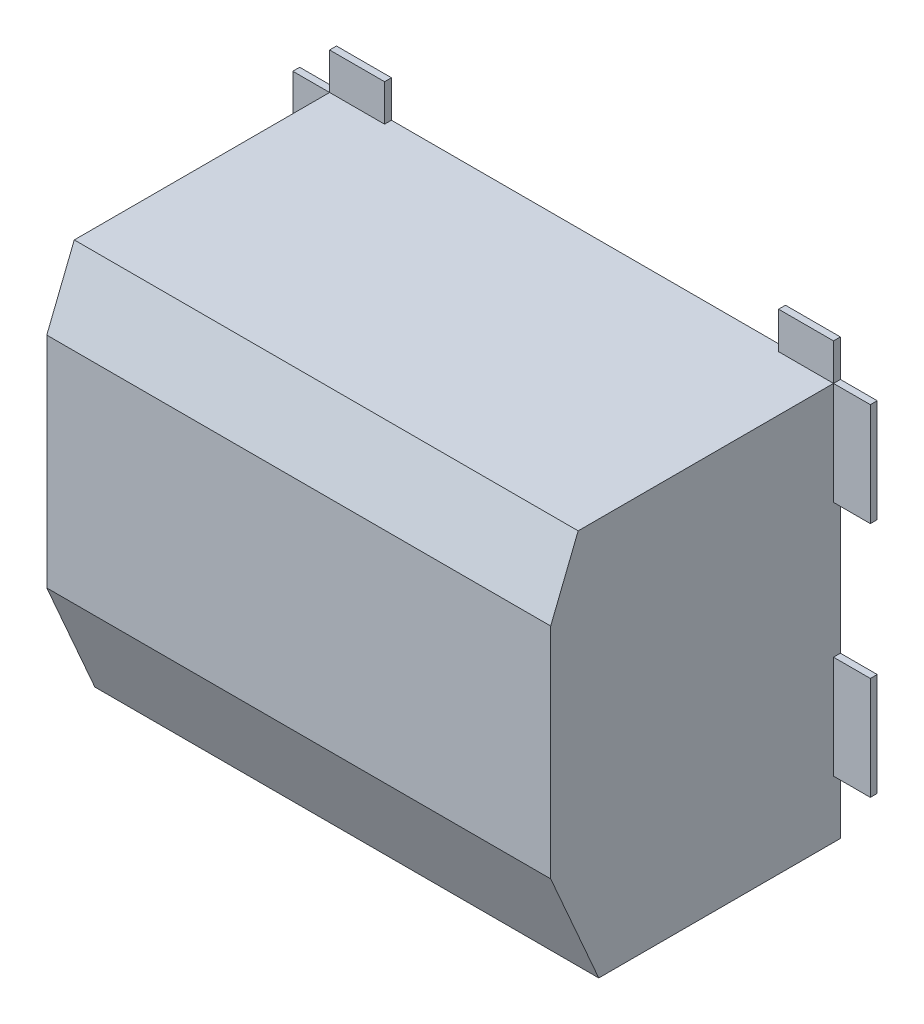
ISO-10303-21;
HEADER;
FILE_DESCRIPTION(('STEP AP214'),'2;1');
FILE_NAME('part.step','',(''),(''),'','','');
FILE_SCHEMA(('AUTOMOTIVE_DESIGN { 1 0 10303 214 1 1 1 1 }'));
ENDSEC;
DATA;
#1=APPLICATION_CONTEXT('core data for automotive mechanical design processes');
#2=APPLICATION_PROTOCOL_DEFINITION('international standard','automotive_design',2000,#1);
#3=PRODUCT_CONTEXT('',#1,'mechanical');
#4=PRODUCT('Part','Part','',(#3));
#5=PRODUCT_RELATED_PRODUCT_CATEGORY('part','',(#4));
#6=PRODUCT_DEFINITION_FORMATION('','',#4);
#7=PRODUCT_DEFINITION_CONTEXT('part definition',#1,'design');
#8=PRODUCT_DEFINITION('design','',#6,#7);
#9=PRODUCT_DEFINITION_SHAPE('','',#8);
#10=(LENGTH_UNIT() NAMED_UNIT(*) SI_UNIT(.MILLI.,.METRE.));
#11=(NAMED_UNIT(*) PLANE_ANGLE_UNIT() SI_UNIT($,.RADIAN.));
#12=(NAMED_UNIT(*) SI_UNIT($,.STERADIAN.) SOLID_ANGLE_UNIT());
#13=UNCERTAINTY_MEASURE_WITH_UNIT(LENGTH_MEASURE(1.E-05),#10,'distance_accuracy_value','');
#14=(GEOMETRIC_REPRESENTATION_CONTEXT(3) GLOBAL_UNCERTAINTY_ASSIGNED_CONTEXT((#13)) GLOBAL_UNIT_ASSIGNED_CONTEXT((#10,
#11,#12)) REPRESENTATION_CONTEXT('',''));
#15=CARTESIAN_POINT('',(0.,0.,0.));
#16=DIRECTION('',(0.,0.,1.));
#17=DIRECTION('',(1.,0.,0.));
#18=AXIS2_PLACEMENT_3D('',#15,#16,#17);
#19=CARTESIAN_POINT('',(0.,157.216,3.175));
#20=DIRECTION('',(0.,1.,0.));
#21=DIRECTION('',(0.,0.,1.));
#22=AXIS2_PLACEMENT_3D('',#19,#20,#21);
#23=PLANE('',#22);
#24=DIRECTION('',(1.,0.,0.));
#25=VECTOR('',#24,1.);
#26=CARTESIAN_POINT('',(-313.4375,157.216,242.425));
#27=LINE('',#26,#25);
#28=CARTESIAN_POINT('',(-279.4015,157.216,242.425));
#29=VERTEX_POINT('',#28);
#30=CARTESIAN_POINT('',(186.4365,157.216,242.425));
#31=VERTEX_POINT('',#30);
#32=EDGE_CURVE('E234',#29,#31,#27,.T.);
#33=ORIENTED_EDGE('',*,*,#32,.T.);
#34=DIRECTION('',(0.,0.,-1.));
#35=VECTOR('',#34,1.);
#36=CARTESIAN_POINT('',(186.4365,157.216,3.175));
#37=LINE('',#36,#35);
#38=CARTESIAN_POINT('',(186.4365,157.216,6.35));
#39=VERTEX_POINT('',#38);
#40=EDGE_CURVE('E249',#31,#39,#37,.T.);
#41=ORIENTED_EDGE('',*,*,#40,.T.);
#42=DIRECTION('',(-1.,0.,0.));
#43=VECTOR('',#42,1.);
#44=CARTESIAN_POINT('',(0.,157.216,6.35));
#45=LINE('',#44,#43);
#46=CARTESIAN_POINT('',(135.6365,157.216,6.35));
#47=VERTEX_POINT('',#46);
#48=EDGE_CURVE('E370',#39,#47,#45,.T.);
#49=ORIENTED_EDGE('',*,*,#48,.T.);
#50=DIRECTION('',(0.,0.,-1.));
#51=VECTOR('',#50,1.);
#52=CARTESIAN_POINT('',(135.6365,157.216,6.35));
#53=LINE('',#52,#51);
#54=CARTESIAN_POINT('',(135.6365,157.216,0.));
#55=VERTEX_POINT('',#54);
#56=EDGE_CURVE('E361',#47,#55,#53,.T.);
#57=ORIENTED_EDGE('',*,*,#56,.T.);
#58=DIRECTION('',(1.,0.,0.));
#59=VECTOR('',#58,1.);
#60=CARTESIAN_POINT('',(0.,157.216,0.));
#61=LINE('',#60,#59);
#62=CARTESIAN_POINT('',(-228.6015,157.216,0.));
#63=VERTEX_POINT('',#62);
#64=EDGE_CURVE('E277',#63,#55,#61,.T.);
#65=ORIENTED_EDGE('',*,*,#64,.F.);
#66=DIRECTION('',(0.,0.,-1.));
#67=VECTOR('',#66,1.);
#68=CARTESIAN_POINT('',(-228.6015,157.216,6.35));
#69=LINE('',#68,#67);
#70=CARTESIAN_POINT('',(-228.6015,157.216,6.35));
#71=VERTEX_POINT('',#70);
#72=EDGE_CURVE('E921',#71,#63,#69,.T.);
#73=ORIENTED_EDGE('',*,*,#72,.F.);
#74=DIRECTION('',(1.,0.,0.));
#75=VECTOR('',#74,1.);
#76=CARTESIAN_POINT('',(-92.965,157.216,6.35));
#77=LINE('',#76,#75);
#78=CARTESIAN_POINT('',(-279.4015,157.216,6.35));
#79=VERTEX_POINT('',#78);
#80=EDGE_CURVE('E928',#79,#71,#77,.T.);
#81=ORIENTED_EDGE('',*,*,#80,.F.);
#82=DIRECTION('',(0.,0.,-1.));
#83=VECTOR('',#82,1.);
#84=CARTESIAN_POINT('',(-279.4015,157.216,3.175));
#85=LINE('',#84,#83);
#86=EDGE_CURVE('E242',#29,#79,#85,.T.);
#87=ORIENTED_EDGE('',*,*,#86,.F.);
#88=EDGE_LOOP('',(#33,#41,#49,#57,#65,#73,#81,#87));
#89=FACE_BOUND('',#88,.T.);
#90=ADVANCED_FACE('F42',(#89),#23,.T.);
#91=DIRECTION('',(0.,0.,-1.));
#92=VECTOR('',#91,1.);
#93=CARTESIAN_POINT('',(-279.4015,157.216,6.35));
#94=LINE('',#93,#92);
#95=CARTESIAN_POINT('',(-279.4015,157.216,0.));
#96=VERTEX_POINT('',#95);
#97=EDGE_CURVE('E917',#79,#96,#94,.T.);
#98=ORIENTED_EDGE('',*,*,#97,.T.);
#99=CARTESIAN_POINT('',(-313.4375,157.216,0.));
#100=VERTEX_POINT('',#99);
#101=EDGE_CURVE('E274',#100,#96,#61,.T.);
#102=ORIENTED_EDGE('',*,*,#101,.F.);
#103=DIRECTION('',(0.,0.,-1.));
#104=VECTOR('',#103,1.);
#105=CARTESIAN_POINT('',(-313.4375,157.216,6.35));
#106=LINE('',#105,#104);
#107=CARTESIAN_POINT('',(-313.4375,157.216,6.35));
#108=VERTEX_POINT('',#107);
#109=EDGE_CURVE('E977',#108,#100,#106,.T.);
#110=ORIENTED_EDGE('',*,*,#109,.F.);
#111=DIRECTION('',(-1.,0.,0.));
#112=VECTOR('',#111,1.);
#113=CARTESIAN_POINT('',(-92.965,157.216,6.35));
#114=LINE('',#113,#112);
#115=EDGE_CURVE('E975',#79,#108,#114,.T.);
#116=ORIENTED_EDGE('',*,*,#115,.F.);
#117=EDGE_LOOP('',(#98,#102,#110,#116));
#118=FACE_BOUND('',#117,.T.);
#119=ADVANCED_FACE('F412',(#118),#23,.T.);
#120=CARTESIAN_POINT('',(186.4365,0.,3.175));
#121=DIRECTION('',(1.,0.,0.));
#122=DIRECTION('',(0.,0.,-1.));
#123=AXIS2_PLACEMENT_3D('',#120,#121,#122);
#124=PLANE('',#123);
#125=DIRECTION('',(0.,0.91615733490219,0.400818834019707));
#126=VECTOR('',#125,1.);
#127=CARTESIAN_POINT('',(186.4365,-115.812452459016,264.71417704918));
#128=LINE('',#127,#126);
#129=CARTESIAN_POINT('',(186.4365,-210.302,223.375));
#130=VERTEX_POINT('',#129);
#131=CARTESIAN_POINT('',(186.4365,-108.702,267.825));
#132=VERTEX_POINT('',#131);
#133=EDGE_CURVE('E64',#130,#132,#128,.T.);
#134=ORIENTED_EDGE('',*,*,#133,.F.);
#135=DIRECTION('',(0.,0.,-1.));
#136=VECTOR('',#135,1.);
#137=CARTESIAN_POINT('',(186.4365,-210.302,3.175));
#138=LINE('',#137,#136);
#139=CARTESIAN_POINT('',(186.4365,-210.302,0.));
#140=VERTEX_POINT('',#139);
#141=EDGE_CURVE('E229',#130,#140,#138,.T.);
#142=ORIENTED_EDGE('',*,*,#141,.T.);
#143=DIRECTION('',(0.,-1.,0.));
#144=VECTOR('',#143,1.);
#145=CARTESIAN_POINT('',(186.4365,0.,0.));
#146=LINE('',#145,#144);
#147=CARTESIAN_POINT('',(186.4365,-157.216,0.));
#148=VERTEX_POINT('',#147);
#149=EDGE_CURVE('E263',#148,#140,#146,.T.);
#150=ORIENTED_EDGE('',*,*,#149,.F.);
#151=DIRECTION('',(0.,0.,-1.));
#152=VECTOR('',#151,1.);
#153=CARTESIAN_POINT('',(186.4365,-157.216,6.35));
#154=LINE('',#153,#152);
#155=CARTESIAN_POINT('',(186.4365,-157.216,6.35));
#156=VERTEX_POINT('',#155);
#157=EDGE_CURVE('E296',#156,#148,#154,.T.);
#158=ORIENTED_EDGE('',*,*,#157,.F.);
#159=DIRECTION('',(0.,1.,0.));
#160=VECTOR('',#159,1.);
#161=CARTESIAN_POINT('',(186.4365,0.,6.35));
#162=LINE('',#161,#160);
#163=CARTESIAN_POINT('',(186.4365,-61.966,6.35));
#164=VERTEX_POINT('',#163);
#165=EDGE_CURVE('E299',#156,#164,#162,.T.);
#166=ORIENTED_EDGE('',*,*,#165,.T.);
#167=DIRECTION('',(0.,0.,-1.));
#168=VECTOR('',#167,1.);
#169=CARTESIAN_POINT('',(186.4365,-61.966,6.35));
#170=LINE('',#169,#168);
#171=CARTESIAN_POINT('',(186.4365,-61.966,0.));
#172=VERTEX_POINT('',#171);
#173=EDGE_CURVE('E301',#164,#172,#170,.T.);
#174=ORIENTED_EDGE('',*,*,#173,.T.);
#175=CARTESIAN_POINT('',(186.4365,61.966,0.));
#176=VERTEX_POINT('',#175);
#177=EDGE_CURVE('E270',#176,#172,#146,.T.);
#178=ORIENTED_EDGE('',*,*,#177,.F.);
#179=DIRECTION('',(0.,0.,-1.));
#180=VECTOR('',#179,1.);
#181=CARTESIAN_POINT('',(186.4365,61.966,6.35));
#182=LINE('',#181,#180);
#183=CARTESIAN_POINT('',(186.4365,61.966,6.35));
#184=VERTEX_POINT('',#183);
#185=EDGE_CURVE('E266',#184,#176,#182,.T.);
#186=ORIENTED_EDGE('',*,*,#185,.F.);
#187=DIRECTION('',(0.,-1.,0.));
#188=VECTOR('',#187,1.);
#189=CARTESIAN_POINT('',(186.4365,0.,6.35));
#190=LINE('',#189,#188);
#191=EDGE_CURVE('E323',#39,#184,#190,.T.);
#192=ORIENTED_EDGE('',*,*,#191,.F.);
#193=ORIENTED_EDGE('',*,*,#40,.F.);
#194=DIRECTION('',(0.,0.928476690885259,-0.371390676354104));
#195=VECTOR('',#194,1.);
#196=CARTESIAN_POINT('',(186.4365,105.279793103448,263.199482758621));
#197=LINE('',#196,#195);
#198=CARTESIAN_POINT('',(186.4365,93.7159999999997,267.825));
#199=VERTEX_POINT('',#198);
#200=EDGE_CURVE('E251',#199,#31,#197,.T.);
#201=ORIENTED_EDGE('',*,*,#200,.F.);
#202=DIRECTION('',(0.,1.,0.));
#203=VECTOR('',#202,1.);
#204=CARTESIAN_POINT('',(186.4365,0.,267.825));
#205=LINE('',#204,#203);
#206=EDGE_CURVE('E233',#132,#199,#205,.T.);
#207=ORIENTED_EDGE('',*,*,#206,.F.);
#208=EDGE_LOOP('',(#134,#142,#150,#158,#166,#174,#178,#186,#192,#193,#201,#207));
#209=FACE_BOUND('',#208,.T.);
#210=ADVANCED_FACE('F44',(#209),#124,.T.);
#211=DIRECTION('',(0.,0.,-1.));
#212=VECTOR('',#211,1.);
#213=CARTESIAN_POINT('',(186.4365,157.216,6.35));
#214=LINE('',#213,#212);
#215=CARTESIAN_POINT('',(186.4365,157.216,0.));
#216=VERTEX_POINT('',#215);
#217=EDGE_CURVE('E352',#39,#216,#214,.T.);
#218=ORIENTED_EDGE('',*,*,#217,.F.);
#219=DIRECTION('',(1.,0.,0.));
#220=VECTOR('',#219,1.);
#221=CARTESIAN_POINT('',(0.,157.216,6.35));
#222=LINE('',#221,#220);
#223=CARTESIAN_POINT('',(220.4725,157.216,6.35));
#224=VERTEX_POINT('',#223);
#225=EDGE_CURVE('E319',#39,#224,#222,.T.);
#226=ORIENTED_EDGE('',*,*,#225,.T.);
#227=DIRECTION('',(0.,0.,-1.));
#228=VECTOR('',#227,1.);
#229=CARTESIAN_POINT('',(220.4725,157.216,6.35));
#230=LINE('',#229,#228);
#231=CARTESIAN_POINT('',(220.4725,157.216,0.));
#232=VERTEX_POINT('',#231);
#233=EDGE_CURVE('E261',#224,#232,#230,.T.);
#234=ORIENTED_EDGE('',*,*,#233,.T.);
#235=EDGE_CURVE('E273',#216,#232,#61,.T.);
#236=ORIENTED_EDGE('',*,*,#235,.F.);
#237=EDGE_LOOP('',(#218,#226,#234,#236));
#238=FACE_BOUND('',#237,.T.);
#239=ADVANCED_FACE('F351',(#238),#23,.T.);
#240=CARTESIAN_POINT('',(-279.4015,0.,3.175));
#241=DIRECTION('',(1.,0.,0.));
#242=DIRECTION('',(0.,0.,-1.));
#243=AXIS2_PLACEMENT_3D('',#240,#241,#242);
#244=PLANE('',#243);
#245=DIRECTION('',(0.,0.,-1.));
#246=VECTOR('',#245,1.);
#247=CARTESIAN_POINT('',(-279.4015,-210.302,3.175));
#248=LINE('',#247,#246);
#249=CARTESIAN_POINT('',(-279.4015,-210.302,223.375));
#250=VERTEX_POINT('',#249);
#251=CARTESIAN_POINT('',(-279.4015,-210.302,0.));
#252=VERTEX_POINT('',#251);
#253=EDGE_CURVE('E240',#250,#252,#248,.T.);
#254=ORIENTED_EDGE('',*,*,#253,.F.);
#255=DIRECTION('',(0.,0.91615733490219,0.400818834019707));
#256=VECTOR('',#255,1.);
#257=CARTESIAN_POINT('',(-279.4015,-114.646550819672,265.224259016393));
#258=LINE('',#257,#256);
#259=CARTESIAN_POINT('',(-279.4015,-108.702,267.825));
#260=VERTEX_POINT('',#259);
#261=EDGE_CURVE('E221',#250,#260,#258,.T.);
#262=ORIENTED_EDGE('',*,*,#261,.T.);
#263=DIRECTION('',(0.,-1.,0.));
#264=VECTOR('',#263,1.);
#265=CARTESIAN_POINT('',(-279.4015,0.,267.825));
#266=LINE('',#265,#264);
#267=CARTESIAN_POINT('',(-279.4015,93.7159999999999,267.825));
#268=VERTEX_POINT('',#267);
#269=EDGE_CURVE('E260',#268,#260,#266,.T.);
#270=ORIENTED_EDGE('',*,*,#269,.F.);
#271=DIRECTION('',(0.,0.928476690885259,-0.371390676354104));
#272=VECTOR('',#271,1.);
#273=CARTESIAN_POINT('',(-279.4015,104.184965517241,263.637413793103));
#274=LINE('',#273,#272);
#275=EDGE_CURVE('E57',#268,#29,#274,.T.);
#276=ORIENTED_EDGE('',*,*,#275,.T.);
#277=ORIENTED_EDGE('',*,*,#86,.T.);
#278=DIRECTION('',(0.,-1.,0.));
#279=VECTOR('',#278,1.);
#280=CARTESIAN_POINT('',(-279.4015,0.,6.35));
#281=LINE('',#280,#279);
#282=CARTESIAN_POINT('',(-279.4015,61.966,6.35));
#283=VERTEX_POINT('',#282);
#284=EDGE_CURVE('E972',#79,#283,#281,.T.);
#285=ORIENTED_EDGE('',*,*,#284,.T.);
#286=DIRECTION('',(0.,0.,-1.));
#287=VECTOR('',#286,1.);
#288=CARTESIAN_POINT('',(-279.4015,61.966,6.35));
#289=LINE('',#288,#287);
#290=CARTESIAN_POINT('',(-279.4015,61.966,0.));
#291=VERTEX_POINT('',#290);
#292=EDGE_CURVE('E984',#283,#291,#289,.T.);
#293=ORIENTED_EDGE('',*,*,#292,.T.);
#294=DIRECTION('',(0.,-1.,0.));
#295=VECTOR('',#294,1.);
#296=CARTESIAN_POINT('',(-279.4015,0.,0.));
#297=LINE('',#296,#295);
#298=CARTESIAN_POINT('',(-279.4015,-61.966,0.));
#299=VERTEX_POINT('',#298);
#300=EDGE_CURVE('E244',#291,#299,#297,.T.);
#301=ORIENTED_EDGE('',*,*,#300,.T.);
#302=DIRECTION('',(0.,0.,-1.));
#303=VECTOR('',#302,1.);
#304=CARTESIAN_POINT('',(-279.4015,-61.966,6.35));
#305=LINE('',#304,#303);
#306=CARTESIAN_POINT('',(-279.4015,-61.966,6.35));
#307=VERTEX_POINT('',#306);
#308=EDGE_CURVE('E962',#307,#299,#305,.T.);
#309=ORIENTED_EDGE('',*,*,#308,.F.);
#310=DIRECTION('',(0.,1.,0.));
#311=VECTOR('',#310,1.);
#312=CARTESIAN_POINT('',(-279.4015,0.,6.35));
#313=LINE('',#312,#311);
#314=CARTESIAN_POINT('',(-279.4015,-157.216,6.35));
#315=VERTEX_POINT('',#314);
#316=EDGE_CURVE('E943',#315,#307,#313,.T.);
#317=ORIENTED_EDGE('',*,*,#316,.F.);
#318=DIRECTION('',(0.,0.,-1.));
#319=VECTOR('',#318,1.);
#320=CARTESIAN_POINT('',(-279.4015,-157.216,6.35));
#321=LINE('',#320,#319);
#322=CARTESIAN_POINT('',(-279.4015,-157.216,0.));
#323=VERTEX_POINT('',#322);
#324=EDGE_CURVE('E286',#315,#323,#321,.T.);
#325=ORIENTED_EDGE('',*,*,#324,.T.);
#326=EDGE_CURVE('E276',#323,#252,#297,.T.);
#327=ORIENTED_EDGE('',*,*,#326,.T.);
#328=EDGE_LOOP('',(#254,#262,#270,#276,#277,#285,#293,#301,#309,#317,#325,#327));
#329=FACE_BOUND('',#328,.T.);
#330=ADVANCED_FACE('F284',(#329),#244,.F.);
#331=CARTESIAN_POINT('',(0.,-210.302,3.175));
#332=DIRECTION('',(0.,1.,0.));
#333=DIRECTION('',(0.,0.,1.));
#334=AXIS2_PLACEMENT_3D('',#331,#332,#333);
#335=PLANE('',#334);
#336=ORIENTED_EDGE('',*,*,#141,.F.);
#337=DIRECTION('',(1.,0.,0.));
#338=VECTOR('',#337,1.);
#339=CARTESIAN_POINT('',(-313.4375,-210.302,223.375));
#340=LINE('',#339,#338);
#341=EDGE_CURVE('E218',#250,#130,#340,.T.);
#342=ORIENTED_EDGE('',*,*,#341,.F.);
#343=ORIENTED_EDGE('',*,*,#253,.T.);
#344=DIRECTION('',(1.,0.,0.));
#345=VECTOR('',#344,1.);
#346=CARTESIAN_POINT('',(0.,-210.302,0.));
#347=LINE('',#346,#345);
#348=EDGE_CURVE('E239',#252,#140,#347,.T.);
#349=ORIENTED_EDGE('',*,*,#348,.T.);
#350=EDGE_LOOP('',(#336,#342,#343,#349));
#351=FACE_BOUND('',#350,.T.);
#352=ADVANCED_FACE('F237',(#351),#335,.F.);
#353=CARTESIAN_POINT('',(0.,0.,0.));
#354=DIRECTION('',(0.,0.,1.));
#355=DIRECTION('',(1.,0.,0.));
#356=AXIS2_PLACEMENT_3D('',#353,#354,#355);
#357=PLANE('',#356);
#358=ORIENTED_EDGE('',*,*,#101,.T.);
#359=DIRECTION('',(0.,1.,0.));
#360=VECTOR('',#359,1.);
#361=CARTESIAN_POINT('',(-279.4015,0.,0.));
#362=LINE('',#361,#360);
#363=CARTESIAN_POINT('',(-279.4015,191.252,0.));
#364=VERTEX_POINT('',#363);
#365=EDGE_CURVE('E924',#96,#364,#362,.T.);
#366=ORIENTED_EDGE('',*,*,#365,.T.);
#367=DIRECTION('',(1.,0.,0.));
#368=VECTOR('',#367,1.);
#369=CARTESIAN_POINT('',(-92.965,191.252,0.));
#370=LINE('',#369,#368);
#371=CARTESIAN_POINT('',(-228.6015,191.252,0.));
#372=VERTEX_POINT('',#371);
#373=EDGE_CURVE('E927',#364,#372,#370,.T.);
#374=ORIENTED_EDGE('',*,*,#373,.T.);
#375=DIRECTION('',(0.,1.,0.));
#376=VECTOR('',#375,1.);
#377=CARTESIAN_POINT('',(-228.6015,0.,0.));
#378=LINE('',#377,#376);
#379=EDGE_CURVE('E910',#63,#372,#378,.T.);
#380=ORIENTED_EDGE('',*,*,#379,.F.);
#381=ORIENTED_EDGE('',*,*,#64,.T.);
#382=DIRECTION('',(0.,1.,0.));
#383=VECTOR('',#382,1.);
#384=CARTESIAN_POINT('',(135.6365,0.,0.));
#385=LINE('',#384,#383);
#386=CARTESIAN_POINT('',(135.6365,191.252,0.));
#387=VERTEX_POINT('',#386);
#388=EDGE_CURVE('E373',#55,#387,#385,.T.);
#389=ORIENTED_EDGE('',*,*,#388,.T.);
#390=DIRECTION('',(-1.,0.,0.));
#391=VECTOR('',#390,1.);
#392=CARTESIAN_POINT('',(0.,191.252,0.));
#393=LINE('',#392,#391);
#394=CARTESIAN_POINT('',(186.4365,191.252,0.));
#395=VERTEX_POINT('',#394);
#396=EDGE_CURVE('E355',#395,#387,#393,.T.);
#397=ORIENTED_EDGE('',*,*,#396,.F.);
#398=DIRECTION('',(0.,1.,0.));
#399=VECTOR('',#398,1.);
#400=CARTESIAN_POINT('',(186.4365,0.,0.));
#401=LINE('',#400,#399);
#402=EDGE_CURVE('E356',#216,#395,#401,.T.);
#403=ORIENTED_EDGE('',*,*,#402,.F.);
#404=ORIENTED_EDGE('',*,*,#235,.T.);
#405=DIRECTION('',(0.,-1.,0.));
#406=VECTOR('',#405,1.);
#407=CARTESIAN_POINT('',(220.4725,0.,0.));
#408=LINE('',#407,#406);
#409=CARTESIAN_POINT('',(220.4725,61.966,0.));
#410=VERTEX_POINT('',#409);
#411=EDGE_CURVE('E315',#232,#410,#408,.T.);
#412=ORIENTED_EDGE('',*,*,#411,.T.);
#413=DIRECTION('',(1.,0.,0.));
#414=VECTOR('',#413,1.);
#415=CARTESIAN_POINT('',(0.,61.966,0.));
#416=LINE('',#415,#414);
#417=EDGE_CURVE('E320',#176,#410,#416,.T.);
#418=ORIENTED_EDGE('',*,*,#417,.F.);
#419=ORIENTED_EDGE('',*,*,#177,.T.);
#420=DIRECTION('',(1.,0.,0.));
#421=VECTOR('',#420,1.);
#422=CARTESIAN_POINT('',(0.,-61.966,0.));
#423=LINE('',#422,#421);
#424=CARTESIAN_POINT('',(220.4725,-61.966,0.));
#425=VERTEX_POINT('',#424);
#426=EDGE_CURVE('E308',#172,#425,#423,.T.);
#427=ORIENTED_EDGE('',*,*,#426,.T.);
#428=DIRECTION('',(0.,1.,0.));
#429=VECTOR('',#428,1.);
#430=CARTESIAN_POINT('',(220.4725,0.,0.));
#431=LINE('',#430,#429);
#432=CARTESIAN_POINT('',(220.4725,-157.216,0.));
#433=VERTEX_POINT('',#432);
#434=EDGE_CURVE('E391',#433,#425,#431,.T.);
#435=ORIENTED_EDGE('',*,*,#434,.F.);
#436=DIRECTION('',(1.,0.,0.));
#437=VECTOR('',#436,1.);
#438=CARTESIAN_POINT('',(0.,-157.216,0.));
#439=LINE('',#438,#437);
#440=EDGE_CURVE('E292',#148,#433,#439,.T.);
#441=ORIENTED_EDGE('',*,*,#440,.F.);
#442=ORIENTED_EDGE('',*,*,#149,.T.);
#443=ORIENTED_EDGE('',*,*,#348,.F.);
#444=ORIENTED_EDGE('',*,*,#326,.F.);
#445=DIRECTION('',(-1.,0.,0.));
#446=VECTOR('',#445,1.);
#447=CARTESIAN_POINT('',(-92.965,-157.216,0.));
#448=LINE('',#447,#446);
#449=CARTESIAN_POINT('',(-313.4375,-157.216,0.));
#450=VERTEX_POINT('',#449);
#451=EDGE_CURVE('E931',#323,#450,#448,.T.);
#452=ORIENTED_EDGE('',*,*,#451,.T.);
#453=DIRECTION('',(0.,1.,0.));
#454=VECTOR('',#453,1.);
#455=CARTESIAN_POINT('',(-313.4375,0.,0.));
#456=LINE('',#455,#454);
#457=CARTESIAN_POINT('',(-313.4375,-61.966,0.));
#458=VERTEX_POINT('',#457);
#459=EDGE_CURVE('E944',#450,#458,#456,.T.);
#460=ORIENTED_EDGE('',*,*,#459,.T.);
#461=DIRECTION('',(-1.,0.,0.));
#462=VECTOR('',#461,1.);
#463=CARTESIAN_POINT('',(-92.965,-61.966,0.));
#464=LINE('',#463,#462);
#465=EDGE_CURVE('E954',#299,#458,#464,.T.);
#466=ORIENTED_EDGE('',*,*,#465,.F.);
#467=ORIENTED_EDGE('',*,*,#300,.F.);
#468=DIRECTION('',(-1.,0.,0.));
#469=VECTOR('',#468,1.);
#470=CARTESIAN_POINT('',(-92.965,61.966,0.));
#471=LINE('',#470,#469);
#472=CARTESIAN_POINT('',(-313.4375,61.966,0.));
#473=VERTEX_POINT('',#472);
#474=EDGE_CURVE('E969',#291,#473,#471,.T.);
#475=ORIENTED_EDGE('',*,*,#474,.T.);
#476=DIRECTION('',(0.,-1.,0.));
#477=VECTOR('',#476,1.);
#478=CARTESIAN_POINT('',(-313.4375,0.,0.));
#479=LINE('',#478,#477);
#480=EDGE_CURVE('E965',#100,#473,#479,.T.);
#481=ORIENTED_EDGE('',*,*,#480,.F.);
#482=EDGE_LOOP('',(#358,#366,#374,#380,#381,#389,#397,#403,#404,#412,#418,#419,#427,#435,#441,
#442,#443,#444,#452,#460,#466,#467,#475,#481));
#483=FACE_BOUND('',#482,.T.);
#484=ADVANCED_FACE('F290',(#483),#357,.F.);
#485=CARTESIAN_POINT('',(0.,0.,267.825));
#486=DIRECTION('',(0.,0.,1.));
#487=DIRECTION('',(1.,0.,0.));
#488=AXIS2_PLACEMENT_3D('',#485,#486,#487);
#489=PLANE('',#488);
#490=DIRECTION('',(-1.,0.,0.));
#491=VECTOR('',#490,1.);
#492=CARTESIAN_POINT('',(0.,-108.702,267.825));
#493=LINE('',#492,#491);
#494=EDGE_CURVE('E11',#132,#260,#493,.T.);
#495=ORIENTED_EDGE('',*,*,#494,.F.);
#496=ORIENTED_EDGE('',*,*,#206,.T.);
#497=DIRECTION('',(1.,0.,0.));
#498=VECTOR('',#497,1.);
#499=CARTESIAN_POINT('',(0.,93.7159999999999,267.825));
#500=LINE('',#499,#498);
#501=EDGE_CURVE('E50',#268,#199,#500,.T.);
#502=ORIENTED_EDGE('',*,*,#501,.F.);
#503=ORIENTED_EDGE('',*,*,#269,.T.);
#504=EDGE_LOOP('',(#495,#496,#502,#503));
#505=FACE_BOUND('',#504,.T.);
#506=ADVANCED_FACE('F259',(#505),#489,.T.);
#507=CARTESIAN_POINT('',(220.4725,0.,6.35));
#508=DIRECTION('',(1.,0.,0.));
#509=DIRECTION('',(0.,0.,-1.));
#510=AXIS2_PLACEMENT_3D('',#507,#508,#509);
#511=PLANE('',#510);
#512=ORIENTED_EDGE('',*,*,#411,.F.);
#513=ORIENTED_EDGE('',*,*,#233,.F.);
#514=DIRECTION('',(0.,-1.,0.));
#515=VECTOR('',#514,1.);
#516=CARTESIAN_POINT('',(220.4725,0.,6.35));
#517=LINE('',#516,#515);
#518=CARTESIAN_POINT('',(220.4725,61.966,6.35));
#519=VERTEX_POINT('',#518);
#520=EDGE_CURVE('E316',#224,#519,#517,.T.);
#521=ORIENTED_EDGE('',*,*,#520,.T.);
#522=DIRECTION('',(0.,0.,-1.));
#523=VECTOR('',#522,1.);
#524=CARTESIAN_POINT('',(220.4725,61.966,6.35));
#525=LINE('',#524,#523);
#526=EDGE_CURVE('E328',#519,#410,#525,.T.);
#527=ORIENTED_EDGE('',*,*,#526,.T.);
#528=EDGE_LOOP('',(#512,#513,#521,#527));
#529=FACE_BOUND('',#528,.T.);
#530=ADVANCED_FACE('F344',(#529),#511,.T.);
#531=CARTESIAN_POINT('',(0.,61.966,6.35));
#532=DIRECTION('',(0.,1.,0.));
#533=DIRECTION('',(0.,0.,1.));
#534=AXIS2_PLACEMENT_3D('',#531,#532,#533);
#535=PLANE('',#534);
#536=ORIENTED_EDGE('',*,*,#417,.T.);
#537=ORIENTED_EDGE('',*,*,#526,.F.);
#538=DIRECTION('',(1.,0.,0.));
#539=VECTOR('',#538,1.);
#540=CARTESIAN_POINT('',(0.,61.966,6.35));
#541=LINE('',#540,#539);
#542=EDGE_CURVE('E326',#184,#519,#541,.T.);
#543=ORIENTED_EDGE('',*,*,#542,.F.);
#544=ORIENTED_EDGE('',*,*,#185,.T.);
#545=EDGE_LOOP('',(#536,#537,#543,#544));
#546=FACE_BOUND('',#545,.T.);
#547=ADVANCED_FACE('F337',(#546),#535,.F.);
#548=CARTESIAN_POINT('',(0.,0.,6.35));
#549=DIRECTION('',(0.,0.,1.));
#550=DIRECTION('',(1.,0.,0.));
#551=AXIS2_PLACEMENT_3D('',#548,#549,#550);
#552=PLANE('',#551);
#553=ORIENTED_EDGE('',*,*,#520,.F.);
#554=ORIENTED_EDGE('',*,*,#225,.F.);
#555=ORIENTED_EDGE('',*,*,#191,.T.);
#556=ORIENTED_EDGE('',*,*,#542,.T.);
#557=EDGE_LOOP('',(#553,#554,#555,#556));
#558=FACE_BOUND('',#557,.T.);
#559=ADVANCED_FACE('F348',(#558),#552,.T.);
#560=CARTESIAN_POINT('',(0.,-157.216,6.35));
#561=DIRECTION('',(0.,1.,0.));
#562=DIRECTION('',(0.,0.,1.));
#563=AXIS2_PLACEMENT_3D('',#560,#561,#562);
#564=PLANE('',#563);
#565=ORIENTED_EDGE('',*,*,#440,.T.);
#566=DIRECTION('',(0.,0.,-1.));
#567=VECTOR('',#566,1.);
#568=CARTESIAN_POINT('',(220.4725,-157.216,6.35));
#569=LINE('',#568,#567);
#570=CARTESIAN_POINT('',(220.4725,-157.216,6.35));
#571=VERTEX_POINT('',#570);
#572=EDGE_CURVE('E312',#571,#433,#569,.T.);
#573=ORIENTED_EDGE('',*,*,#572,.F.);
#574=DIRECTION('',(1.,0.,0.));
#575=VECTOR('',#574,1.);
#576=CARTESIAN_POINT('',(0.,-157.216,6.35));
#577=LINE('',#576,#575);
#578=EDGE_CURVE('E384',#156,#571,#577,.T.);
#579=ORIENTED_EDGE('',*,*,#578,.F.);
#580=ORIENTED_EDGE('',*,*,#157,.T.);
#581=EDGE_LOOP('',(#565,#573,#579,#580));
#582=FACE_BOUND('',#581,.T.);
#583=ADVANCED_FACE('F402',(#582),#564,.F.);
#584=CARTESIAN_POINT('',(220.4725,0.,6.35));
#585=DIRECTION('',(-1.,0.,0.));
#586=DIRECTION('',(0.,0.,1.));
#587=AXIS2_PLACEMENT_3D('',#584,#585,#586);
#588=PLANE('',#587);
#589=ORIENTED_EDGE('',*,*,#434,.T.);
#590=DIRECTION('',(0.,0.,-1.));
#591=VECTOR('',#590,1.);
#592=CARTESIAN_POINT('',(220.4725,-61.966,6.35));
#593=LINE('',#592,#591);
#594=CARTESIAN_POINT('',(220.4725,-61.966,6.35));
#595=VERTEX_POINT('',#594);
#596=EDGE_CURVE('E303',#595,#425,#593,.T.);
#597=ORIENTED_EDGE('',*,*,#596,.F.);
#598=DIRECTION('',(0.,1.,0.));
#599=VECTOR('',#598,1.);
#600=CARTESIAN_POINT('',(220.4725,0.,6.35));
#601=LINE('',#600,#599);
#602=EDGE_CURVE('E387',#571,#595,#601,.T.);
#603=ORIENTED_EDGE('',*,*,#602,.F.);
#604=ORIENTED_EDGE('',*,*,#572,.T.);
#605=EDGE_LOOP('',(#589,#597,#603,#604));
#606=FACE_BOUND('',#605,.T.);
#607=ADVANCED_FACE('F398',(#606),#588,.F.);
#608=CARTESIAN_POINT('',(0.,-61.966,6.35));
#609=DIRECTION('',(0.,1.,0.));
#610=DIRECTION('',(0.,0.,1.));
#611=AXIS2_PLACEMENT_3D('',#608,#609,#610);
#612=PLANE('',#611);
#613=ORIENTED_EDGE('',*,*,#426,.F.);
#614=ORIENTED_EDGE('',*,*,#173,.F.);
#615=DIRECTION('',(1.,0.,0.));
#616=VECTOR('',#615,1.);
#617=CARTESIAN_POINT('',(0.,-61.966,6.35));
#618=LINE('',#617,#616);
#619=EDGE_CURVE('E305',#164,#595,#618,.T.);
#620=ORIENTED_EDGE('',*,*,#619,.T.);
#621=ORIENTED_EDGE('',*,*,#596,.T.);
#622=EDGE_LOOP('',(#613,#614,#620,#621));
#623=FACE_BOUND('',#622,.T.);
#624=ADVANCED_FACE('F396',(#623),#612,.T.);
#625=CARTESIAN_POINT('',(0.,0.,6.35));
#626=DIRECTION('',(0.,0.,1.));
#627=DIRECTION('',(1.,0.,0.));
#628=AXIS2_PLACEMENT_3D('',#625,#626,#627);
#629=PLANE('',#628);
#630=ORIENTED_EDGE('',*,*,#578,.T.);
#631=ORIENTED_EDGE('',*,*,#602,.T.);
#632=ORIENTED_EDGE('',*,*,#619,.F.);
#633=ORIENTED_EDGE('',*,*,#165,.F.);
#634=EDGE_LOOP('',(#630,#631,#632,#633));
#635=FACE_BOUND('',#634,.T.);
#636=ADVANCED_FACE('F401',(#635),#629,.T.);
#637=CARTESIAN_POINT('',(135.6365,0.,6.35));
#638=DIRECTION('',(-1.,0.,0.));
#639=DIRECTION('',(0.,0.,1.));
#640=AXIS2_PLACEMENT_3D('',#637,#638,#639);
#641=PLANE('',#640);
#642=ORIENTED_EDGE('',*,*,#388,.F.);
#643=ORIENTED_EDGE('',*,*,#56,.F.);
#644=DIRECTION('',(0.,1.,0.));
#645=VECTOR('',#644,1.);
#646=CARTESIAN_POINT('',(135.6365,0.,6.35));
#647=LINE('',#646,#645);
#648=CARTESIAN_POINT('',(135.6365,191.252,6.35));
#649=VERTEX_POINT('',#648);
#650=EDGE_CURVE('E371',#47,#649,#647,.T.);
#651=ORIENTED_EDGE('',*,*,#650,.T.);
#652=DIRECTION('',(0.,0.,-1.));
#653=VECTOR('',#652,1.);
#654=CARTESIAN_POINT('',(135.6365,191.252,6.35));
#655=LINE('',#654,#653);
#656=EDGE_CURVE('E369',#649,#387,#655,.T.);
#657=ORIENTED_EDGE('',*,*,#656,.T.);
#658=EDGE_LOOP('',(#642,#643,#651,#657));
#659=FACE_BOUND('',#658,.T.);
#660=ADVANCED_FACE('F599',(#659),#641,.T.);
#661=CARTESIAN_POINT('',(186.4365,0.,6.35));
#662=DIRECTION('',(-1.,0.,0.));
#663=DIRECTION('',(0.,0.,1.));
#664=AXIS2_PLACEMENT_3D('',#661,#662,#663);
#665=PLANE('',#664);
#666=ORIENTED_EDGE('',*,*,#402,.T.);
#667=DIRECTION('',(0.,0.,-1.));
#668=VECTOR('',#667,1.);
#669=CARTESIAN_POINT('',(186.4365,191.252,6.35));
#670=LINE('',#669,#668);
#671=CARTESIAN_POINT('',(186.4365,191.252,6.35));
#672=VERTEX_POINT('',#671);
#673=EDGE_CURVE('E359',#672,#395,#670,.T.);
#674=ORIENTED_EDGE('',*,*,#673,.F.);
#675=DIRECTION('',(0.,1.,0.));
#676=VECTOR('',#675,1.);
#677=CARTESIAN_POINT('',(186.4365,0.,6.35));
#678=LINE('',#677,#676);
#679=EDGE_CURVE('E368',#39,#672,#678,.T.);
#680=ORIENTED_EDGE('',*,*,#679,.F.);
#681=ORIENTED_EDGE('',*,*,#217,.T.);
#682=EDGE_LOOP('',(#666,#674,#680,#681));
#683=FACE_BOUND('',#682,.T.);
#684=ADVANCED_FACE('F590',(#683),#665,.F.);
#685=CARTESIAN_POINT('',(0.,191.252,6.35));
#686=DIRECTION('',(0.,-1.,0.));
#687=DIRECTION('',(0.,0.,-1.));
#688=AXIS2_PLACEMENT_3D('',#685,#686,#687);
#689=PLANE('',#688);
#690=ORIENTED_EDGE('',*,*,#396,.T.);
#691=ORIENTED_EDGE('',*,*,#656,.F.);
#692=DIRECTION('',(-1.,0.,0.));
#693=VECTOR('',#692,1.);
#694=CARTESIAN_POINT('',(0.,191.252,6.35));
#695=LINE('',#694,#693);
#696=EDGE_CURVE('E376',#672,#649,#695,.T.);
#697=ORIENTED_EDGE('',*,*,#696,.F.);
#698=ORIENTED_EDGE('',*,*,#673,.T.);
#699=EDGE_LOOP('',(#690,#691,#697,#698));
#700=FACE_BOUND('',#699,.T.);
#701=ADVANCED_FACE('F581',(#700),#689,.F.);
#702=CARTESIAN_POINT('',(0.,0.,6.35));
#703=DIRECTION('',(0.,0.,1.));
#704=DIRECTION('',(1.,0.,0.));
#705=AXIS2_PLACEMENT_3D('',#702,#703,#704);
#706=PLANE('',#705);
#707=ORIENTED_EDGE('',*,*,#650,.F.);
#708=ORIENTED_EDGE('',*,*,#48,.F.);
#709=ORIENTED_EDGE('',*,*,#679,.T.);
#710=ORIENTED_EDGE('',*,*,#696,.T.);
#711=EDGE_LOOP('',(#707,#708,#709,#710));
#712=FACE_BOUND('',#711,.T.);
#713=ADVANCED_FACE('F565',(#712),#706,.T.);
#714=CARTESIAN_POINT('',(-313.4375,0.,6.35));
#715=DIRECTION('',(1.,0.,0.));
#716=DIRECTION('',(0.,0.,-1.));
#717=AXIS2_PLACEMENT_3D('',#714,#715,#716);
#718=PLANE('',#717);
#719=ORIENTED_EDGE('',*,*,#480,.T.);
#720=DIRECTION('',(0.,0.,-1.));
#721=VECTOR('',#720,1.);
#722=CARTESIAN_POINT('',(-313.4375,61.966,6.35));
#723=LINE('',#722,#721);
#724=CARTESIAN_POINT('',(-313.4375,61.966,6.35));
#725=VERTEX_POINT('',#724);
#726=EDGE_CURVE('E383',#725,#473,#723,.T.);
#727=ORIENTED_EDGE('',*,*,#726,.F.);
#728=DIRECTION('',(0.,-1.,0.));
#729=VECTOR('',#728,1.);
#730=CARTESIAN_POINT('',(-313.4375,0.,6.35));
#731=LINE('',#730,#729);
#732=EDGE_CURVE('E966',#108,#725,#731,.T.);
#733=ORIENTED_EDGE('',*,*,#732,.F.);
#734=ORIENTED_EDGE('',*,*,#109,.T.);
#735=EDGE_LOOP('',(#719,#727,#733,#734));
#736=FACE_BOUND('',#735,.T.);
#737=ADVANCED_FACE('F556',(#736),#718,.F.);
#738=CARTESIAN_POINT('',(-92.965,61.966,6.35));
#739=DIRECTION('',(0.,-1.,0.));
#740=DIRECTION('',(0.,0.,-1.));
#741=AXIS2_PLACEMENT_3D('',#738,#739,#740);
#742=PLANE('',#741);
#743=ORIENTED_EDGE('',*,*,#474,.F.);
#744=ORIENTED_EDGE('',*,*,#292,.F.);
#745=DIRECTION('',(-1.,0.,0.));
#746=VECTOR('',#745,1.);
#747=CARTESIAN_POINT('',(-92.965,61.966,6.35));
#748=LINE('',#747,#746);
#749=EDGE_CURVE('E968',#283,#725,#748,.T.);
#750=ORIENTED_EDGE('',*,*,#749,.T.);
#751=ORIENTED_EDGE('',*,*,#726,.T.);
#752=EDGE_LOOP('',(#743,#744,#750,#751));
#753=FACE_BOUND('',#752,.T.);
#754=ADVANCED_FACE('F547',(#753),#742,.T.);
#755=CARTESIAN_POINT('',(-92.965,0.,6.35));
#756=DIRECTION('',(0.,0.,1.));
#757=DIRECTION('',(-1.,0.,0.));
#758=AXIS2_PLACEMENT_3D('',#755,#756,#757);
#759=PLANE('',#758);
#760=ORIENTED_EDGE('',*,*,#732,.T.);
#761=ORIENTED_EDGE('',*,*,#749,.F.);
#762=ORIENTED_EDGE('',*,*,#284,.F.);
#763=ORIENTED_EDGE('',*,*,#115,.T.);
#764=EDGE_LOOP('',(#760,#761,#762,#763));
#765=FACE_BOUND('',#764,.T.);
#766=ADVANCED_FACE('F538',(#765),#759,.T.);
#767=CARTESIAN_POINT('',(-92.965,-157.216,6.35));
#768=DIRECTION('',(0.,-1.,0.));
#769=DIRECTION('',(0.,0.,-1.));
#770=AXIS2_PLACEMENT_3D('',#767,#768,#769);
#771=PLANE('',#770);
#772=ORIENTED_EDGE('',*,*,#451,.F.);
#773=ORIENTED_EDGE('',*,*,#324,.F.);
#774=DIRECTION('',(-1.,0.,0.));
#775=VECTOR('',#774,1.);
#776=CARTESIAN_POINT('',(-92.965,-157.216,6.35));
#777=LINE('',#776,#775);
#778=CARTESIAN_POINT('',(-313.4375,-157.216,6.35));
#779=VERTEX_POINT('',#778);
#780=EDGE_CURVE('E940',#315,#779,#777,.T.);
#781=ORIENTED_EDGE('',*,*,#780,.T.);
#782=DIRECTION('',(0.,0.,-1.));
#783=VECTOR('',#782,1.);
#784=CARTESIAN_POINT('',(-313.4375,-157.216,6.35));
#785=LINE('',#784,#783);
#786=EDGE_CURVE('E952',#779,#450,#785,.T.);
#787=ORIENTED_EDGE('',*,*,#786,.T.);
#788=EDGE_LOOP('',(#772,#773,#781,#787));
#789=FACE_BOUND('',#788,.T.);
#790=ADVANCED_FACE('F529',(#789),#771,.T.);
#791=CARTESIAN_POINT('',(-92.965,-61.966,6.35));
#792=DIRECTION('',(0.,-1.,0.));
#793=DIRECTION('',(0.,0.,-1.));
#794=AXIS2_PLACEMENT_3D('',#791,#792,#793);
#795=PLANE('',#794);
#796=ORIENTED_EDGE('',*,*,#465,.T.);
#797=DIRECTION('',(0.,0.,-1.));
#798=VECTOR('',#797,1.);
#799=CARTESIAN_POINT('',(-313.4375,-61.966,6.35));
#800=LINE('',#799,#798);
#801=CARTESIAN_POINT('',(-313.4375,-61.966,6.35));
#802=VERTEX_POINT('',#801);
#803=EDGE_CURVE('E960',#802,#458,#800,.T.);
#804=ORIENTED_EDGE('',*,*,#803,.F.);
#805=DIRECTION('',(-1.,0.,0.));
#806=VECTOR('',#805,1.);
#807=CARTESIAN_POINT('',(-92.965,-61.966,6.35));
#808=LINE('',#807,#806);
#809=EDGE_CURVE('E947',#307,#802,#808,.T.);
#810=ORIENTED_EDGE('',*,*,#809,.F.);
#811=ORIENTED_EDGE('',*,*,#308,.T.);
#812=EDGE_LOOP('',(#796,#804,#810,#811));
#813=FACE_BOUND('',#812,.T.);
#814=ADVANCED_FACE('F520',(#813),#795,.F.);
#815=CARTESIAN_POINT('',(-313.4375,0.,6.35));
#816=DIRECTION('',(-1.,0.,0.));
#817=DIRECTION('',(0.,0.,1.));
#818=AXIS2_PLACEMENT_3D('',#815,#816,#817);
#819=PLANE('',#818);
#820=ORIENTED_EDGE('',*,*,#459,.F.);
#821=ORIENTED_EDGE('',*,*,#786,.F.);
#822=DIRECTION('',(0.,1.,0.));
#823=VECTOR('',#822,1.);
#824=CARTESIAN_POINT('',(-313.4375,0.,6.35));
#825=LINE('',#824,#823);
#826=EDGE_CURVE('E949',#779,#802,#825,.T.);
#827=ORIENTED_EDGE('',*,*,#826,.T.);
#828=ORIENTED_EDGE('',*,*,#803,.T.);
#829=EDGE_LOOP('',(#820,#821,#827,#828));
#830=FACE_BOUND('',#829,.T.);
#831=ADVANCED_FACE('F511',(#830),#819,.T.);
#832=CARTESIAN_POINT('',(-92.965,0.,6.35));
#833=DIRECTION('',(0.,0.,1.));
#834=DIRECTION('',(-1.,0.,0.));
#835=AXIS2_PLACEMENT_3D('',#832,#833,#834);
#836=PLANE('',#835);
#837=ORIENTED_EDGE('',*,*,#780,.F.);
#838=ORIENTED_EDGE('',*,*,#316,.T.);
#839=ORIENTED_EDGE('',*,*,#809,.T.);
#840=ORIENTED_EDGE('',*,*,#826,.F.);
#841=EDGE_LOOP('',(#837,#838,#839,#840));
#842=FACE_BOUND('',#841,.T.);
#843=ADVANCED_FACE('F502',(#842),#836,.T.);
#844=CARTESIAN_POINT('',(-228.6015,0.,6.35));
#845=DIRECTION('',(-1.,0.,0.));
#846=DIRECTION('',(0.,0.,1.));
#847=AXIS2_PLACEMENT_3D('',#844,#845,#846);
#848=PLANE('',#847);
#849=ORIENTED_EDGE('',*,*,#379,.T.);
#850=DIRECTION('',(0.,0.,-1.));
#851=VECTOR('',#850,1.);
#852=CARTESIAN_POINT('',(-228.6015,191.252,6.35));
#853=LINE('',#852,#851);
#854=CARTESIAN_POINT('',(-228.6015,191.252,6.35));
#855=VERTEX_POINT('',#854);
#856=EDGE_CURVE('E911',#855,#372,#853,.T.);
#857=ORIENTED_EDGE('',*,*,#856,.F.);
#858=DIRECTION('',(0.,1.,0.));
#859=VECTOR('',#858,1.);
#860=CARTESIAN_POINT('',(-228.6015,0.,6.35));
#861=LINE('',#860,#859);
#862=EDGE_CURVE('E920',#71,#855,#861,.T.);
#863=ORIENTED_EDGE('',*,*,#862,.F.);
#864=ORIENTED_EDGE('',*,*,#72,.T.);
#865=EDGE_LOOP('',(#849,#857,#863,#864));
#866=FACE_BOUND('',#865,.T.);
#867=ADVANCED_FACE('F493',(#866),#848,.F.);
#868=CARTESIAN_POINT('',(-92.965,191.252,6.35));
#869=DIRECTION('',(0.,1.,0.));
#870=DIRECTION('',(0.,0.,1.));
#871=AXIS2_PLACEMENT_3D('',#868,#869,#870);
#872=PLANE('',#871);
#873=ORIENTED_EDGE('',*,*,#373,.F.);
#874=DIRECTION('',(0.,0.,-1.));
#875=VECTOR('',#874,1.);
#876=CARTESIAN_POINT('',(-279.4015,191.252,6.35));
#877=LINE('',#876,#875);
#878=CARTESIAN_POINT('',(-279.4015,191.252,6.35));
#879=VERTEX_POINT('',#878);
#880=EDGE_CURVE('E915',#879,#364,#877,.T.);
#881=ORIENTED_EDGE('',*,*,#880,.F.);
#882=DIRECTION('',(1.,0.,0.));
#883=VECTOR('',#882,1.);
#884=CARTESIAN_POINT('',(-92.965,191.252,6.35));
#885=LINE('',#884,#883);
#886=EDGE_CURVE('E914',#879,#855,#885,.T.);
#887=ORIENTED_EDGE('',*,*,#886,.T.);
#888=ORIENTED_EDGE('',*,*,#856,.T.);
#889=EDGE_LOOP('',(#873,#881,#887,#888));
#890=FACE_BOUND('',#889,.T.);
#891=ADVANCED_FACE('F484',(#890),#872,.T.);
#892=CARTESIAN_POINT('',(-279.4015,0.,6.35));
#893=DIRECTION('',(-1.,0.,0.));
#894=DIRECTION('',(0.,0.,1.));
#895=AXIS2_PLACEMENT_3D('',#892,#893,#894);
#896=PLANE('',#895);
#897=ORIENTED_EDGE('',*,*,#365,.F.);
#898=ORIENTED_EDGE('',*,*,#97,.F.);
#899=DIRECTION('',(0.,1.,0.));
#900=VECTOR('',#899,1.);
#901=CARTESIAN_POINT('',(-279.4015,0.,6.35));
#902=LINE('',#901,#900);
#903=EDGE_CURVE('E913',#79,#879,#902,.T.);
#904=ORIENTED_EDGE('',*,*,#903,.T.);
#905=ORIENTED_EDGE('',*,*,#880,.T.);
#906=EDGE_LOOP('',(#897,#898,#904,#905));
#907=FACE_BOUND('',#906,.T.);
#908=ADVANCED_FACE('F475',(#907),#896,.T.);
#909=CARTESIAN_POINT('',(-92.965,0.,6.35));
#910=DIRECTION('',(0.,0.,1.));
#911=DIRECTION('',(-1.,0.,0.));
#912=AXIS2_PLACEMENT_3D('',#909,#910,#911);
#913=PLANE('',#912);
#914=ORIENTED_EDGE('',*,*,#862,.T.);
#915=ORIENTED_EDGE('',*,*,#886,.F.);
#916=ORIENTED_EDGE('',*,*,#903,.F.);
#917=ORIENTED_EDGE('',*,*,#80,.T.);
#918=EDGE_LOOP('',(#914,#915,#916,#917));
#919=FACE_BOUND('',#918,.T.);
#920=ADVANCED_FACE('F458',(#919),#913,.T.);
#921=CARTESIAN_POINT('',(-313.4375,105.279793103448,263.199482758621));
#922=DIRECTION('',(0.,-0.371390676354104,-0.928476690885259));
#923=DIRECTION('',(0.,0.928476690885259,-0.371390676354104));
#924=AXIS2_PLACEMENT_3D('',#921,#922,#923);
#925=PLANE('',#924);
#926=ORIENTED_EDGE('',*,*,#501,.T.);
#927=ORIENTED_EDGE('',*,*,#200,.T.);
#928=ORIENTED_EDGE('',*,*,#32,.F.);
#929=ORIENTED_EDGE('',*,*,#275,.F.);
#930=EDGE_LOOP('',(#926,#927,#928,#929));
#931=FACE_BOUND('',#930,.T.);
#932=ADVANCED_FACE('F250',(#931),#925,.F.);
#933=CARTESIAN_POINT('',(-313.4375,-115.812452459016,264.71417704918));
#934=DIRECTION('',(0.,0.400818834019707,-0.91615733490219));
#935=DIRECTION('',(0.,0.91615733490219,0.400818834019707));
#936=AXIS2_PLACEMENT_3D('',#933,#934,#935);
#937=PLANE('',#936);
#938=ORIENTED_EDGE('',*,*,#341,.T.);
#939=ORIENTED_EDGE('',*,*,#133,.T.);
#940=ORIENTED_EDGE('',*,*,#494,.T.);
#941=ORIENTED_EDGE('',*,*,#261,.F.);
#942=EDGE_LOOP('',(#938,#939,#940,#941));
#943=FACE_BOUND('',#942,.T.);
#944=ADVANCED_FACE('F219',(#943),#937,.F.);
#945=CLOSED_SHELL('',(#90,#119,#210,#239,#330,#352,#484,#506,#530,#547,#559,#583,#607,#624,#636,
#660,#684,#701,#713,#737,#754,#766,#790,#814,#831,#843,#867,#891,#908,#920,#932,#944));
#946=MANIFOLD_SOLID_BREP('B2',#945);
#947=ADVANCED_BREP_SHAPE_REPRESENTATION('',(#18,#946),#14);
#948=SHAPE_DEFINITION_REPRESENTATION(#9,#947);
ENDSEC;
END-ISO-10303-21;
